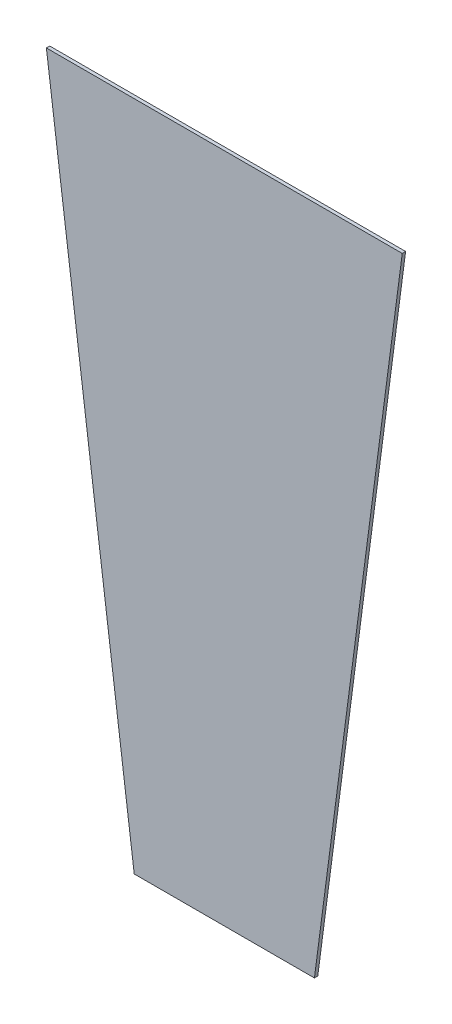
ISO-10303-21;
HEADER;
FILE_DESCRIPTION(('STEP AP214'),'2;1');
FILE_NAME('part.step','',(''),(''),'','','');
FILE_SCHEMA(('AUTOMOTIVE_DESIGN { 1 0 10303 214 1 1 1 1 }'));
ENDSEC;
DATA;
#1=APPLICATION_CONTEXT('core data for automotive mechanical design processes');
#2=APPLICATION_PROTOCOL_DEFINITION('international standard','automotive_design',2000,#1);
#3=PRODUCT_CONTEXT('',#1,'mechanical');
#4=PRODUCT('Part','Part','',(#3));
#5=PRODUCT_RELATED_PRODUCT_CATEGORY('part','',(#4));
#6=PRODUCT_DEFINITION_FORMATION('','',#4);
#7=PRODUCT_DEFINITION_CONTEXT('part definition',#1,'design');
#8=PRODUCT_DEFINITION('design','',#6,#7);
#9=PRODUCT_DEFINITION_SHAPE('','',#8);
#10=(LENGTH_UNIT() NAMED_UNIT(*) SI_UNIT(.MILLI.,.METRE.));
#11=(NAMED_UNIT(*) PLANE_ANGLE_UNIT() SI_UNIT($,.RADIAN.));
#12=(NAMED_UNIT(*) SI_UNIT($,.STERADIAN.) SOLID_ANGLE_UNIT());
#13=UNCERTAINTY_MEASURE_WITH_UNIT(LENGTH_MEASURE(1.E-05),#10,'distance_accuracy_value','');
#14=(GEOMETRIC_REPRESENTATION_CONTEXT(3) GLOBAL_UNCERTAINTY_ASSIGNED_CONTEXT((#13)) GLOBAL_UNIT_ASSIGNED_CONTEXT((#10,
#11,#12)) REPRESENTATION_CONTEXT('',''));
#15=CARTESIAN_POINT('',(0.,0.,0.));
#16=DIRECTION('',(0.,0.,1.));
#17=DIRECTION('',(1.,0.,0.));
#18=AXIS2_PLACEMENT_3D('',#15,#16,#17);
#19=CARTESIAN_POINT('',(-106.,200.,2.));
#20=DIRECTION('',(0.,-1.,0.));
#21=DIRECTION('',(0.,0.,-1.));
#22=AXIS2_PLACEMENT_3D('',#19,#20,#21);
#23=PLANE('',#22);
#24=DIRECTION('',(-1.,0.,0.));
#25=VECTOR('',#24,1.);
#26=CARTESIAN_POINT('',(-106.,200.,0.));
#27=LINE('',#26,#25);
#28=CARTESIAN_POINT('',(106.,200.,0.));
#29=VERTEX_POINT('',#28);
#30=CARTESIAN_POINT('',(-106.,200.,0.));
#31=VERTEX_POINT('',#30);
#32=EDGE_CURVE('E90',#29,#31,#27,.T.);
#33=ORIENTED_EDGE('',*,*,#32,.T.);
#34=DIRECTION('',(0.,0.,-1.));
#35=VECTOR('',#34,1.);
#36=CARTESIAN_POINT('',(-106.,200.,2.));
#37=LINE('',#36,#35);
#38=CARTESIAN_POINT('',(-106.,200.,2.));
#39=VERTEX_POINT('',#38);
#40=EDGE_CURVE('E39',#39,#31,#37,.T.);
#41=ORIENTED_EDGE('',*,*,#40,.F.);
#42=DIRECTION('',(-1.,0.,0.));
#43=VECTOR('',#42,1.);
#44=CARTESIAN_POINT('',(-106.,200.,2.));
#45=LINE('',#44,#43);
#46=CARTESIAN_POINT('',(106.,200.,2.));
#47=VERTEX_POINT('',#46);
#48=EDGE_CURVE('E81',#47,#39,#45,.T.);
#49=ORIENTED_EDGE('',*,*,#48,.F.);
#50=DIRECTION('',(0.,0.,-1.));
#51=VECTOR('',#50,1.);
#52=CARTESIAN_POINT('',(106.,200.,2.));
#53=LINE('',#52,#51);
#54=EDGE_CURVE('E11',#47,#29,#53,.T.);
#55=ORIENTED_EDGE('',*,*,#54,.T.);
#56=EDGE_LOOP('',(#33,#41,#49,#55));
#57=FACE_BOUND('',#56,.T.);
#58=ADVANCED_FACE('F32',(#57),#23,.F.);
#59=CARTESIAN_POINT('',(-106.,-200.,2.));
#60=DIRECTION('',(0.,1.,0.));
#61=DIRECTION('',(0.,0.,1.));
#62=AXIS2_PLACEMENT_3D('',#59,#60,#61);
#63=PLANE('',#62);
#64=DIRECTION('',(1.,0.,0.));
#65=VECTOR('',#64,1.);
#66=CARTESIAN_POINT('',(-106.,-200.,2.));
#67=LINE('',#66,#65);
#68=CARTESIAN_POINT('',(-53.6751164835021,-200.,2.));
#69=VERTEX_POINT('',#68);
#70=CARTESIAN_POINT('',(53.6751164835022,-200.,2.));
#71=VERTEX_POINT('',#70);
#72=EDGE_CURVE('E85',#69,#71,#67,.T.);
#73=ORIENTED_EDGE('',*,*,#72,.F.);
#74=DIRECTION('',(0.,0.,-1.));
#75=VECTOR('',#74,1.);
#76=CARTESIAN_POINT('',(-53.6751164835021,-200.,2.));
#77=LINE('',#76,#75);
#78=CARTESIAN_POINT('',(-53.6751164835021,-200.,0.));
#79=VERTEX_POINT('',#78);
#80=EDGE_CURVE('E73',#69,#79,#77,.T.);
#81=ORIENTED_EDGE('',*,*,#80,.T.);
#82=DIRECTION('',(1.,0.,0.));
#83=VECTOR('',#82,1.);
#84=CARTESIAN_POINT('',(-106.,-200.,0.));
#85=LINE('',#84,#83);
#86=CARTESIAN_POINT('',(53.6751164835022,-200.,0.));
#87=VERTEX_POINT('',#86);
#88=EDGE_CURVE('E86',#79,#87,#85,.T.);
#89=ORIENTED_EDGE('',*,*,#88,.T.);
#90=DIRECTION('',(0.,0.,-1.));
#91=VECTOR('',#90,1.);
#92=CARTESIAN_POINT('',(53.6751164835022,-200.,2.));
#93=LINE('',#92,#91);
#94=EDGE_CURVE('E46',#71,#87,#93,.T.);
#95=ORIENTED_EDGE('',*,*,#94,.F.);
#96=EDGE_LOOP('',(#73,#81,#89,#95));
#97=FACE_BOUND('',#96,.T.);
#98=ADVANCED_FACE('F104',(#97),#63,.F.);
#99=CARTESIAN_POINT('',(0.,0.,2.));
#100=DIRECTION('',(0.,0.,-1.));
#101=DIRECTION('',(-1.,0.,0.));
#102=AXIS2_PLACEMENT_3D('',#99,#100,#101);
#103=PLANE('',#102);
#104=ORIENTED_EDGE('',*,*,#48,.T.);
#105=DIRECTION('',(0.129707152494827,-0.991552345865655,0.));
#106=VECTOR('',#105,1.);
#107=CARTESIAN_POINT('',(-53.6751164835021,-200.,2.));
#108=LINE('',#107,#106);
#109=EDGE_CURVE('E69',#39,#69,#108,.T.);
#110=ORIENTED_EDGE('',*,*,#109,.T.);
#111=ORIENTED_EDGE('',*,*,#72,.T.);
#112=DIRECTION('',(0.129707152494827,0.991552345865655,0.));
#113=VECTOR('',#112,1.);
#114=CARTESIAN_POINT('',(53.6751164835022,-200.,2.));
#115=LINE('',#114,#113);
#116=EDGE_CURVE('E83',#71,#47,#115,.T.);
#117=ORIENTED_EDGE('',*,*,#116,.T.);
#118=EDGE_LOOP('',(#104,#110,#111,#117));
#119=FACE_BOUND('',#118,.T.);
#120=ADVANCED_FACE('F82',(#119),#103,.F.);
#121=CARTESIAN_POINT('',(0.,0.,0.));
#122=DIRECTION('',(0.,0.,-1.));
#123=DIRECTION('',(-1.,0.,0.));
#124=AXIS2_PLACEMENT_3D('',#121,#122,#123);
#125=PLANE('',#124);
#126=DIRECTION('',(0.129707152494827,-0.991552345865655,0.));
#127=VECTOR('',#126,1.);
#128=CARTESIAN_POINT('',(-53.6751164835021,-200.,0.));
#129=LINE('',#128,#127);
#130=EDGE_CURVE('E77',#31,#79,#129,.T.);
#131=ORIENTED_EDGE('',*,*,#130,.F.);
#132=ORIENTED_EDGE('',*,*,#32,.F.);
#133=DIRECTION('',(0.129707152494827,0.991552345865655,0.));
#134=VECTOR('',#133,1.);
#135=CARTESIAN_POINT('',(53.6751164835022,-200.,0.));
#136=LINE('',#135,#134);
#137=EDGE_CURVE('E97',#87,#29,#136,.T.);
#138=ORIENTED_EDGE('',*,*,#137,.F.);
#139=ORIENTED_EDGE('',*,*,#88,.F.);
#140=EDGE_LOOP('',(#131,#132,#138,#139));
#141=FACE_BOUND('',#140,.T.);
#142=ADVANCED_FACE('F105',(#141),#125,.T.);
#143=CARTESIAN_POINT('',(53.6751164835022,-200.,2.));
#144=DIRECTION('',(-0.991552345865655,0.129707152494827,0.));
#145=DIRECTION('',(-0.129707152494827,-0.991552345865655,0.));
#146=AXIS2_PLACEMENT_3D('',#143,#144,#145);
#147=PLANE('',#146);
#148=ORIENTED_EDGE('',*,*,#137,.T.);
#149=ORIENTED_EDGE('',*,*,#54,.F.);
#150=ORIENTED_EDGE('',*,*,#116,.F.);
#151=ORIENTED_EDGE('',*,*,#94,.T.);
#152=EDGE_LOOP('',(#148,#149,#150,#151));
#153=FACE_BOUND('',#152,.T.);
#154=ADVANCED_FACE('F106',(#153),#147,.F.);
#155=CARTESIAN_POINT('',(-53.6751164835021,-200.,2.));
#156=DIRECTION('',(0.991552345865655,0.129707152494827,0.));
#157=DIRECTION('',(-0.129707152494827,0.991552345865655,0.));
#158=AXIS2_PLACEMENT_3D('',#155,#156,#157);
#159=PLANE('',#158);
#160=ORIENTED_EDGE('',*,*,#130,.T.);
#161=ORIENTED_EDGE('',*,*,#80,.F.);
#162=ORIENTED_EDGE('',*,*,#109,.F.);
#163=ORIENTED_EDGE('',*,*,#40,.T.);
#164=EDGE_LOOP('',(#160,#161,#162,#163));
#165=FACE_BOUND('',#164,.T.);
#166=ADVANCED_FACE('F71',(#165),#159,.F.);
#167=CLOSED_SHELL('',(#58,#98,#120,#142,#154,#166));
#168=MANIFOLD_SOLID_BREP('B2',#167);
#169=ADVANCED_BREP_SHAPE_REPRESENTATION('',(#18,#168),#14);
#170=SHAPE_DEFINITION_REPRESENTATION(#9,#169);
ENDSEC;
END-ISO-10303-21;
